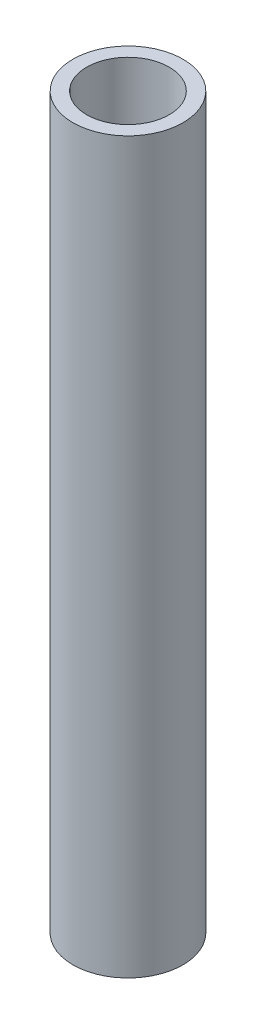
ISO-10303-21;
HEADER;
FILE_DESCRIPTION(('STEP AP214'),'2;1');
FILE_NAME('part.step','',(''),(''),'','','');
FILE_SCHEMA(('AUTOMOTIVE_DESIGN { 1 0 10303 214 1 1 1 1 }'));
ENDSEC;
DATA;
#1=APPLICATION_CONTEXT('core data for automotive mechanical design processes');
#2=APPLICATION_PROTOCOL_DEFINITION('international standard','automotive_design',2000,#1);
#3=PRODUCT_CONTEXT('',#1,'mechanical');
#4=PRODUCT('Part','Part','',(#3));
#5=PRODUCT_RELATED_PRODUCT_CATEGORY('part','',(#4));
#6=PRODUCT_DEFINITION_FORMATION('','',#4);
#7=PRODUCT_DEFINITION_CONTEXT('part definition',#1,'design');
#8=PRODUCT_DEFINITION('design','',#6,#7);
#9=PRODUCT_DEFINITION_SHAPE('','',#8);
#10=(LENGTH_UNIT() NAMED_UNIT(*) SI_UNIT(.MILLI.,.METRE.));
#11=(NAMED_UNIT(*) PLANE_ANGLE_UNIT() SI_UNIT($,.RADIAN.));
#12=(NAMED_UNIT(*) SI_UNIT($,.STERADIAN.) SOLID_ANGLE_UNIT());
#13=UNCERTAINTY_MEASURE_WITH_UNIT(LENGTH_MEASURE(1.E-05),#10,'distance_accuracy_value','');
#14=(GEOMETRIC_REPRESENTATION_CONTEXT(3) GLOBAL_UNCERTAINTY_ASSIGNED_CONTEXT((#13)) GLOBAL_UNIT_ASSIGNED_CONTEXT((#10,
#11,#12)) REPRESENTATION_CONTEXT('',''));
#15=CARTESIAN_POINT('',(0.,0.,0.));
#16=DIRECTION('',(0.,0.,1.));
#17=DIRECTION('',(1.,0.,0.));
#18=AXIS2_PLACEMENT_3D('',#15,#16,#17);
#19=CARTESIAN_POINT('',(0.,-13.25,0.));
#20=DIRECTION('',(0.,1.,0.));
#21=DIRECTION('',(0.,0.,1.));
#22=AXIS2_PLACEMENT_3D('',#19,#20,#21);
#23=CYLINDRICAL_SURFACE('',#22,2.);
#24=CARTESIAN_POINT('',(0.,-13.25,0.));
#25=DIRECTION('',(0.,1.,0.));
#26=DIRECTION('',(0.,0.,1.));
#27=AXIS2_PLACEMENT_3D('',#24,#25,#26);
#28=CIRCLE('',#27,2.);
#29=CARTESIAN_POINT('',(0.,-13.25,2.));
#30=VERTEX_POINT('',#29);
#31=EDGE_CURVE('E10',#30,#30,#28,.T.);
#32=ORIENTED_EDGE('',*,*,#31,.T.);
#33=EDGE_LOOP('',(#32));
#34=FACE_BOUND('',#33,.T.);
#35=CARTESIAN_POINT('',(0.,13.25,0.));
#36=DIRECTION('',(0.,1.,0.));
#37=DIRECTION('',(0.,0.,1.));
#38=AXIS2_PLACEMENT_3D('',#35,#36,#37);
#39=CIRCLE('',#38,2.);
#40=CARTESIAN_POINT('',(0.,13.25,2.));
#41=VERTEX_POINT('',#40);
#42=EDGE_CURVE('E39',#41,#41,#39,.T.);
#43=ORIENTED_EDGE('',*,*,#42,.F.);
#44=EDGE_LOOP('',(#43));
#45=FACE_BOUND('',#44,.T.);
#46=ADVANCED_FACE('F29',(#34,#45),#23,.T.);
#47=CARTESIAN_POINT('',(0.,-13.25,0.));
#48=DIRECTION('',(0.,1.,0.));
#49=DIRECTION('',(0.,0.,1.));
#50=AXIS2_PLACEMENT_3D('',#47,#48,#49);
#51=PLANE('',#50);
#52=CARTESIAN_POINT('',(0.,-13.25,0.));
#53=DIRECTION('',(0.,1.,0.));
#54=DIRECTION('',(0.,0.,1.));
#55=AXIS2_PLACEMENT_3D('',#52,#53,#54);
#56=CIRCLE('',#55,1.5);
#57=CARTESIAN_POINT('',(0.,-13.25,1.5));
#58=VERTEX_POINT('',#57);
#59=EDGE_CURVE('E35',#58,#58,#56,.T.);
#60=ORIENTED_EDGE('',*,*,#59,.T.);
#61=EDGE_LOOP('',(#60));
#62=FACE_BOUND('',#61,.T.);
#63=ORIENTED_EDGE('',*,*,#31,.F.);
#64=EDGE_LOOP('',(#63));
#65=FACE_BOUND('',#64,.T.);
#66=ADVANCED_FACE('F58',(#62,#65),#51,.F.);
#67=CARTESIAN_POINT('',(0.,-13.25,0.));
#68=DIRECTION('',(0.,1.,0.));
#69=DIRECTION('',(0.,0.,1.));
#70=AXIS2_PLACEMENT_3D('',#67,#68,#69);
#71=CYLINDRICAL_SURFACE('',#70,1.5);
#72=ORIENTED_EDGE('',*,*,#59,.F.);
#73=EDGE_LOOP('',(#72));
#74=FACE_BOUND('',#73,.T.);
#75=CARTESIAN_POINT('',(0.,13.25,0.));
#76=DIRECTION('',(0.,1.,0.));
#77=DIRECTION('',(0.,0.,1.));
#78=AXIS2_PLACEMENT_3D('',#75,#76,#77);
#79=CIRCLE('',#78,1.5);
#80=CARTESIAN_POINT('',(0.,13.25,1.5));
#81=VERTEX_POINT('',#80);
#82=EDGE_CURVE('E43',#81,#81,#79,.T.);
#83=ORIENTED_EDGE('',*,*,#82,.T.);
#84=EDGE_LOOP('',(#83));
#85=FACE_BOUND('',#84,.T.);
#86=ADVANCED_FACE('F49',(#74,#85),#71,.F.);
#87=CARTESIAN_POINT('',(0.,13.25,0.));
#88=DIRECTION('',(0.,1.,0.));
#89=DIRECTION('',(0.,0.,1.));
#90=AXIS2_PLACEMENT_3D('',#87,#88,#89);
#91=PLANE('',#90);
#92=ORIENTED_EDGE('',*,*,#42,.T.);
#93=EDGE_LOOP('',(#92));
#94=FACE_BOUND('',#93,.T.);
#95=ORIENTED_EDGE('',*,*,#82,.F.);
#96=EDGE_LOOP('',(#95));
#97=FACE_BOUND('',#96,.T.);
#98=ADVANCED_FACE('F51',(#94,#97),#91,.T.);
#99=CLOSED_SHELL('',(#46,#66,#86,#98));
#100=MANIFOLD_SOLID_BREP('B2',#99);
#101=ADVANCED_BREP_SHAPE_REPRESENTATION('',(#18,#100),#14);
#102=SHAPE_DEFINITION_REPRESENTATION(#9,#101);
ENDSEC;
END-ISO-10303-21;
